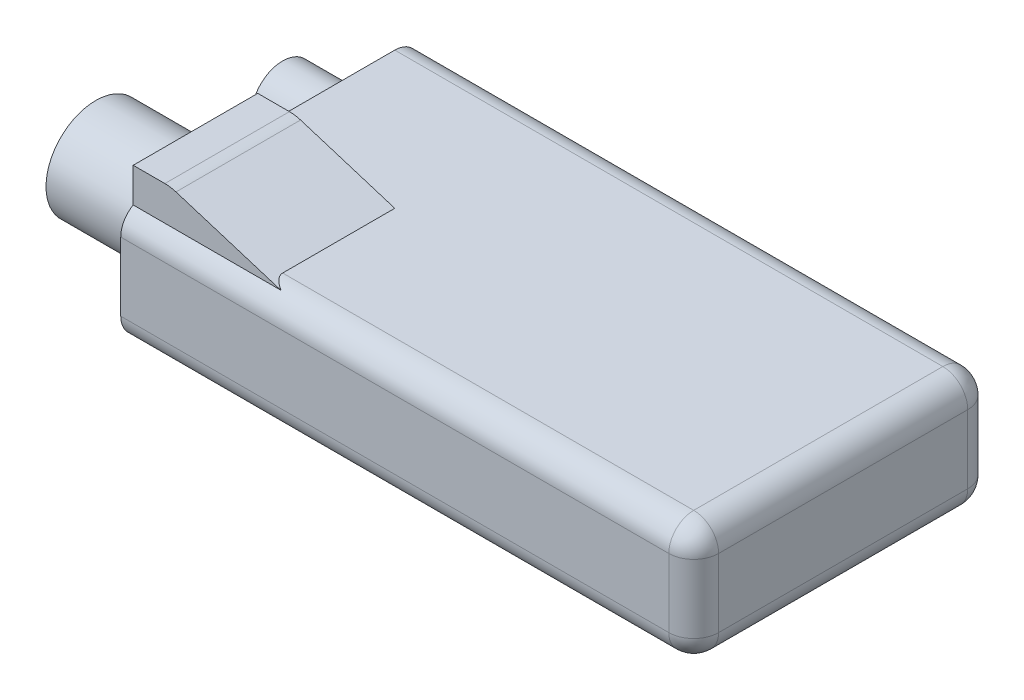
ISO-10303-21;
HEADER;
FILE_DESCRIPTION(('STEP AP214'),'2;1');
FILE_NAME('part.step','',(''),(''),'','','');
FILE_SCHEMA(('AUTOMOTIVE_DESIGN { 1 0 10303 214 1 1 1 1 }'));
ENDSEC;
DATA;
#1=APPLICATION_CONTEXT('core data for automotive mechanical design processes');
#2=APPLICATION_PROTOCOL_DEFINITION('international standard','automotive_design',2000,#1);
#3=PRODUCT_CONTEXT('',#1,'mechanical');
#4=PRODUCT('Part','Part','',(#3));
#5=PRODUCT_RELATED_PRODUCT_CATEGORY('part','',(#4));
#6=PRODUCT_DEFINITION_FORMATION('','',#4);
#7=PRODUCT_DEFINITION_CONTEXT('part definition',#1,'design');
#8=PRODUCT_DEFINITION('design','',#6,#7);
#9=PRODUCT_DEFINITION_SHAPE('','',#8);
#10=(LENGTH_UNIT() NAMED_UNIT(*) SI_UNIT(.MILLI.,.METRE.));
#11=(NAMED_UNIT(*) PLANE_ANGLE_UNIT() SI_UNIT($,.RADIAN.));
#12=(NAMED_UNIT(*) SI_UNIT($,.STERADIAN.) SOLID_ANGLE_UNIT());
#13=UNCERTAINTY_MEASURE_WITH_UNIT(LENGTH_MEASURE(1.E-05),#10,'distance_accuracy_value','');
#14=(GEOMETRIC_REPRESENTATION_CONTEXT(3) GLOBAL_UNCERTAINTY_ASSIGNED_CONTEXT((#13)) GLOBAL_UNIT_ASSIGNED_CONTEXT((#10,
#11,#12)) REPRESENTATION_CONTEXT('',''));
#15=CARTESIAN_POINT('',(0.,0.,0.));
#16=DIRECTION('',(0.,0.,1.));
#17=DIRECTION('',(1.,0.,0.));
#18=AXIS2_PLACEMENT_3D('',#15,#16,#17);
#19=CARTESIAN_POINT('',(-23.,9.5,-12.));
#20=DIRECTION('',(1.,0.,0.));
#21=DIRECTION('',(0.,0.,-1.));
#22=AXIS2_PLACEMENT_3D('',#19,#20,#21);
#23=PLANE('',#22);
#24=CARTESIAN_POINT('',(-23.,6.,6.));
#25=DIRECTION('',(-1.,0.,0.));
#26=DIRECTION('',(0.,0.,1.));
#27=AXIS2_PLACEMENT_3D('',#24,#25,#26);
#28=CIRCLE('',#27,4.);
#29=CARTESIAN_POINT('',(-23.,6.,10.));
#30=VERTEX_POINT('',#29);
#31=EDGE_CURVE('E162',#30,#30,#28,.T.);
#32=ORIENTED_EDGE('',*,*,#31,.F.);
#33=EDGE_LOOP('',(#32));
#34=FACE_BOUND('',#33,.T.);
#35=DIRECTION('',(0.,0.,1.));
#36=VECTOR('',#35,1.);
#37=CARTESIAN_POINT('',(-23.,0.,-12.));
#38=LINE('',#37,#36);
#39=CARTESIAN_POINT('',(-23.,0.,-10.));
#40=VERTEX_POINT('',#39);
#41=CARTESIAN_POINT('',(-23.,0.,10.));
#42=VERTEX_POINT('',#41);
#43=EDGE_CURVE('E196',#40,#42,#38,.T.);
#44=ORIENTED_EDGE('',*,*,#43,.T.);
#45=CARTESIAN_POINT('',(-23.,2.,10.));
#46=DIRECTION('',(1.,0.,0.));
#47=DIRECTION('',(0.,0.,-1.));
#48=AXIS2_PLACEMENT_3D('',#45,#46,#47);
#49=CIRCLE('',#48,2.);
#50=CARTESIAN_POINT('',(-23.,2.,12.));
#51=VERTEX_POINT('',#50);
#52=EDGE_CURVE('E233',#42,#51,#49,.F.);
#53=ORIENTED_EDGE('',*,*,#52,.T.);
#54=DIRECTION('',(0.,-1.,0.));
#55=VECTOR('',#54,1.);
#56=CARTESIAN_POINT('',(-23.,9.5,12.));
#57=LINE('',#56,#55);
#58=CARTESIAN_POINT('',(-23.,7.5,12.));
#59=VERTEX_POINT('',#58);
#60=EDGE_CURVE('E201',#59,#51,#57,.T.);
#61=ORIENTED_EDGE('',*,*,#60,.F.);
#62=CARTESIAN_POINT('',(-23.,7.5,10.));
#63=DIRECTION('',(1.,0.,0.));
#64=DIRECTION('',(0.,0.,-1.));
#65=AXIS2_PLACEMENT_3D('',#62,#63,#64);
#66=CIRCLE('',#65,2.);
#67=CARTESIAN_POINT('',(-23.,9.23205080756888,11.));
#68=VERTEX_POINT('',#67);
#69=EDGE_CURVE('E226',#59,#68,#66,.F.);
#70=ORIENTED_EDGE('',*,*,#69,.T.);
#71=DIRECTION('',(0.,1.,0.));
#72=VECTOR('',#71,1.);
#73=CARTESIAN_POINT('',(-23.,6.00753183787218,11.));
#74=LINE('',#73,#72);
#75=CARTESIAN_POINT('',(-23.,11.9924681621278,11.));
#76=VERTEX_POINT('',#75);
#77=EDGE_CURVE('E183',#68,#76,#74,.T.);
#78=ORIENTED_EDGE('',*,*,#77,.T.);
#79=DIRECTION('',(0.,0.,-1.));
#80=VECTOR('',#79,1.);
#81=CARTESIAN_POINT('',(-23.,11.9924681621278,11.));
#82=LINE('',#81,#80);
#83=CARTESIAN_POINT('',(-23.,11.9924681621278,1.));
#84=VERTEX_POINT('',#83);
#85=EDGE_CURVE('E186',#76,#84,#82,.T.);
#86=ORIENTED_EDGE('',*,*,#85,.T.);
#87=DIRECTION('',(0.,-1.,0.));
#88=VECTOR('',#87,1.);
#89=CARTESIAN_POINT('',(-23.,6.00753183787218,1.));
#90=LINE('',#89,#88);
#91=CARTESIAN_POINT('',(-23.,9.5,1.));
#92=VERTEX_POINT('',#91);
#93=EDGE_CURVE('E171',#84,#92,#90,.T.);
#94=ORIENTED_EDGE('',*,*,#93,.T.);
#95=DIRECTION('',(0.,0.,1.));
#96=VECTOR('',#95,1.);
#97=CARTESIAN_POINT('',(-23.,9.5,-12.));
#98=LINE('',#97,#96);
#99=CARTESIAN_POINT('',(-23.,9.5,-10.));
#100=VERTEX_POINT('',#99);
#101=EDGE_CURVE('E157',#100,#92,#98,.T.);
#102=ORIENTED_EDGE('',*,*,#101,.F.);
#103=CARTESIAN_POINT('',(-23.,7.5,-10.));
#104=DIRECTION('',(1.,0.,0.));
#105=DIRECTION('',(0.,0.,-1.));
#106=AXIS2_PLACEMENT_3D('',#103,#104,#105);
#107=CIRCLE('',#106,2.);
#108=CARTESIAN_POINT('',(-23.,7.5,-12.));
#109=VERTEX_POINT('',#108);
#110=EDGE_CURVE('E229',#100,#109,#107,.F.);
#111=ORIENTED_EDGE('',*,*,#110,.T.);
#112=DIRECTION('',(0.,-1.,0.));
#113=VECTOR('',#112,1.);
#114=CARTESIAN_POINT('',(-23.,9.5,-12.));
#115=LINE('',#114,#113);
#116=CARTESIAN_POINT('',(-23.,2.,-12.));
#117=VERTEX_POINT('',#116);
#118=EDGE_CURVE('E199',#109,#117,#115,.T.);
#119=ORIENTED_EDGE('',*,*,#118,.T.);
#120=CARTESIAN_POINT('',(-23.,2.,-10.));
#121=DIRECTION('',(1.,0.,0.));
#122=DIRECTION('',(0.,0.,-1.));
#123=AXIS2_PLACEMENT_3D('',#120,#121,#122);
#124=CIRCLE('',#123,2.);
#125=EDGE_CURVE('E231',#117,#40,#124,.F.);
#126=ORIENTED_EDGE('',*,*,#125,.T.);
#127=EDGE_LOOP('',(#44,#53,#61,#70,#78,#86,#94,#102,#111,#119,#126));
#128=FACE_BOUND('',#127,.T.);
#129=CARTESIAN_POINT('',(-23.,4.74939435504496,-7.));
#130=DIRECTION('',(1.,0.,0.));
#131=DIRECTION('',(0.,0.,-1.));
#132=AXIS2_PLACEMENT_3D('',#129,#130,#131);
#133=CIRCLE('',#132,2.5);
#134=CARTESIAN_POINT('',(-23.,4.74939435504496,-9.5));
#135=VERTEX_POINT('',#134);
#136=EDGE_CURVE('E161',#135,#135,#133,.F.);
#137=ORIENTED_EDGE('',*,*,#136,.F.);
#138=EDGE_LOOP('',(#137));
#139=FACE_BOUND('',#138,.T.);
#140=ADVANCED_FACE('F40',(#34,#128,#139),#23,.F.);
#141=CARTESIAN_POINT('',(23.,9.5,-12.));
#142=DIRECTION('',(-1.,0.,0.));
#143=DIRECTION('',(0.,0.,1.));
#144=AXIS2_PLACEMENT_3D('',#141,#142,#143);
#145=PLANE('',#144);
#146=DIRECTION('',(0.,-1.,0.));
#147=VECTOR('',#146,1.);
#148=CARTESIAN_POINT('',(23.,9.5,-10.));
#149=LINE('',#148,#147);
#150=CARTESIAN_POINT('',(23.,2.,-10.));
#151=VERTEX_POINT('',#150);
#152=CARTESIAN_POINT('',(23.,7.5,-10.));
#153=VERTEX_POINT('',#152);
#154=EDGE_CURVE('E257',#151,#153,#149,.F.);
#155=ORIENTED_EDGE('',*,*,#154,.T.);
#156=DIRECTION('',(0.,0.,-1.));
#157=VECTOR('',#156,1.);
#158=CARTESIAN_POINT('',(23.,7.5,10.));
#159=LINE('',#158,#157);
#160=CARTESIAN_POINT('',(23.,7.5,10.));
#161=VERTEX_POINT('',#160);
#162=EDGE_CURVE('E259',#153,#161,#159,.F.);
#163=ORIENTED_EDGE('',*,*,#162,.T.);
#164=DIRECTION('',(0.,-1.,0.));
#165=VECTOR('',#164,1.);
#166=CARTESIAN_POINT('',(23.,9.5,10.));
#167=LINE('',#166,#165);
#168=CARTESIAN_POINT('',(23.,2.,10.));
#169=VERTEX_POINT('',#168);
#170=EDGE_CURVE('E253',#161,#169,#167,.T.);
#171=ORIENTED_EDGE('',*,*,#170,.T.);
#172=DIRECTION('',(0.,0.,-1.));
#173=VECTOR('',#172,1.);
#174=CARTESIAN_POINT('',(23.,2.,-12.));
#175=LINE('',#174,#173);
#176=EDGE_CURVE('E255',#169,#151,#175,.T.);
#177=ORIENTED_EDGE('',*,*,#176,.T.);
#178=EDGE_LOOP('',(#155,#163,#171,#177));
#179=FACE_BOUND('',#178,.T.);
#180=ADVANCED_FACE('F308',(#179),#145,.F.);
#181=CARTESIAN_POINT('',(-23.,9.5,-12.));
#182=DIRECTION('',(0.,0.,1.));
#183=DIRECTION('',(1.,0.,0.));
#184=AXIS2_PLACEMENT_3D('',#181,#182,#183);
#185=PLANE('',#184);
#186=DIRECTION('',(-1.,0.,0.));
#187=VECTOR('',#186,1.);
#188=CARTESIAN_POINT('',(23.,7.5,-12.));
#189=LINE('',#188,#187);
#190=CARTESIAN_POINT('',(21.,7.5,-12.));
#191=VERTEX_POINT('',#190);
#192=EDGE_CURVE('E235',#109,#191,#189,.F.);
#193=ORIENTED_EDGE('',*,*,#192,.T.);
#194=DIRECTION('',(0.,-1.,0.));
#195=VECTOR('',#194,1.);
#196=CARTESIAN_POINT('',(21.,9.5,-12.));
#197=LINE('',#196,#195);
#198=CARTESIAN_POINT('',(21.,2.,-12.));
#199=VERTEX_POINT('',#198);
#200=EDGE_CURVE('E264',#191,#199,#197,.T.);
#201=ORIENTED_EDGE('',*,*,#200,.T.);
#202=DIRECTION('',(-1.,0.,0.));
#203=VECTOR('',#202,1.);
#204=CARTESIAN_POINT('',(-23.,2.,-12.));
#205=LINE('',#204,#203);
#206=EDGE_CURVE('E238',#199,#117,#205,.T.);
#207=ORIENTED_EDGE('',*,*,#206,.T.);
#208=ORIENTED_EDGE('',*,*,#118,.F.);
#209=EDGE_LOOP('',(#193,#201,#207,#208));
#210=FACE_BOUND('',#209,.T.);
#211=ADVANCED_FACE('F314',(#210),#185,.F.);
#212=CARTESIAN_POINT('',(-23.,9.5,12.));
#213=DIRECTION('',(0.,0.,-1.));
#214=DIRECTION('',(-1.,0.,0.));
#215=AXIS2_PLACEMENT_3D('',#212,#213,#214);
#216=PLANE('',#215);
#217=DIRECTION('',(1.,0.,0.));
#218=VECTOR('',#217,1.);
#219=CARTESIAN_POINT('',(-23.,2.,12.));
#220=LINE('',#219,#218);
#221=CARTESIAN_POINT('',(21.,2.,12.));
#222=VERTEX_POINT('',#221);
#223=EDGE_CURVE('E220',#51,#222,#220,.T.);
#224=ORIENTED_EDGE('',*,*,#223,.T.);
#225=DIRECTION('',(0.,-1.,0.));
#226=VECTOR('',#225,1.);
#227=CARTESIAN_POINT('',(21.,9.5,12.));
#228=LINE('',#227,#226);
#229=CARTESIAN_POINT('',(21.,7.5,12.));
#230=VERTEX_POINT('',#229);
#231=EDGE_CURVE('E11',#222,#230,#228,.F.);
#232=ORIENTED_EDGE('',*,*,#231,.T.);
#233=DIRECTION('',(1.,0.,0.));
#234=VECTOR('',#233,1.);
#235=CARTESIAN_POINT('',(-23.,7.5,12.));
#236=LINE('',#235,#234);
#237=EDGE_CURVE('E218',#230,#59,#236,.F.);
#238=ORIENTED_EDGE('',*,*,#237,.T.);
#239=ORIENTED_EDGE('',*,*,#60,.T.);
#240=EDGE_LOOP('',(#224,#232,#238,#239));
#241=FACE_BOUND('',#240,.T.);
#242=ADVANCED_FACE('F321',(#241),#216,.F.);
#243=CARTESIAN_POINT('',(0.,9.5,0.));
#244=DIRECTION('',(0.,1.,0.));
#245=DIRECTION('',(0.,0.,1.));
#246=AXIS2_PLACEMENT_3D('',#243,#244,#245);
#247=PLANE('',#246);
#248=DIRECTION('',(1.,0.,0.));
#249=VECTOR('',#248,1.);
#250=CARTESIAN_POINT('',(23.,9.5,10.));
#251=LINE('',#250,#249);
#252=CARTESIAN_POINT('',(-12.,9.5,10.));
#253=VERTEX_POINT('',#252);
#254=CARTESIAN_POINT('',(21.,9.5,10.));
#255=VERTEX_POINT('',#254);
#256=EDGE_CURVE('E240',#253,#255,#251,.T.);
#257=ORIENTED_EDGE('',*,*,#256,.T.);
#258=DIRECTION('',(0.,0.,-1.));
#259=VECTOR('',#258,1.);
#260=CARTESIAN_POINT('',(21.,9.5,-10.));
#261=LINE('',#260,#259);
#262=CARTESIAN_POINT('',(21.,9.5,-10.));
#263=VERTEX_POINT('',#262);
#264=EDGE_CURVE('E251',#255,#263,#261,.T.);
#265=ORIENTED_EDGE('',*,*,#264,.T.);
#266=DIRECTION('',(-1.,0.,0.));
#267=VECTOR('',#266,1.);
#268=CARTESIAN_POINT('',(-23.,9.5,-10.));
#269=LINE('',#268,#267);
#270=EDGE_CURVE('E242',#263,#100,#269,.T.);
#271=ORIENTED_EDGE('',*,*,#270,.T.);
#272=ORIENTED_EDGE('',*,*,#101,.T.);
#273=DIRECTION('',(-1.,0.,0.));
#274=VECTOR('',#273,1.);
#275=CARTESIAN_POINT('',(0.,9.5,0.999999999999999));
#276=LINE('',#275,#274);
#277=CARTESIAN_POINT('',(-12.,9.5,1.));
#278=VERTEX_POINT('',#277);
#279=EDGE_CURVE('E149',#278,#92,#276,.T.);
#280=ORIENTED_EDGE('',*,*,#279,.F.);
#281=DIRECTION('',(0.,0.,1.));
#282=VECTOR('',#281,1.);
#283=CARTESIAN_POINT('',(-12.,9.5,-7.3792838321196));
#284=LINE('',#283,#282);
#285=EDGE_CURVE('E154',#278,#253,#284,.T.);
#286=ORIENTED_EDGE('',*,*,#285,.T.);
#287=EDGE_LOOP('',(#257,#265,#271,#272,#280,#286));
#288=FACE_BOUND('',#287,.T.);
#289=ADVANCED_FACE('F152',(#288),#247,.T.);
#290=CARTESIAN_POINT('',(0.,0.,0.));
#291=DIRECTION('',(0.,1.,0.));
#292=DIRECTION('',(0.,0.,1.));
#293=AXIS2_PLACEMENT_3D('',#290,#291,#292);
#294=PLANE('',#293);
#295=DIRECTION('',(-1.,0.,0.));
#296=VECTOR('',#295,1.);
#297=CARTESIAN_POINT('',(0.,0.,-10.));
#298=LINE('',#297,#296);
#299=CARTESIAN_POINT('',(21.,0.,-10.));
#300=VERTEX_POINT('',#299);
#301=EDGE_CURVE('E222',#40,#300,#298,.F.);
#302=ORIENTED_EDGE('',*,*,#301,.T.);
#303=DIRECTION('',(0.,0.,-1.));
#304=VECTOR('',#303,1.);
#305=CARTESIAN_POINT('',(21.,0.,0.));
#306=LINE('',#305,#304);
#307=CARTESIAN_POINT('',(21.,0.,10.));
#308=VERTEX_POINT('',#307);
#309=EDGE_CURVE('E64',#300,#308,#306,.F.);
#310=ORIENTED_EDGE('',*,*,#309,.T.);
#311=DIRECTION('',(1.,0.,0.));
#312=VECTOR('',#311,1.);
#313=CARTESIAN_POINT('',(0.,0.,10.));
#314=LINE('',#313,#312);
#315=EDGE_CURVE('E224',#308,#42,#314,.F.);
#316=ORIENTED_EDGE('',*,*,#315,.T.);
#317=ORIENTED_EDGE('',*,*,#43,.F.);
#318=EDGE_LOOP('',(#302,#310,#316,#317));
#319=FACE_BOUND('',#318,.T.);
#320=ADVANCED_FACE('F410',(#319),#294,.F.);
#321=CARTESIAN_POINT('',(-31.,6.,6.));
#322=DIRECTION('',(1.,0.,0.));
#323=DIRECTION('',(0.,0.,-1.));
#324=AXIS2_PLACEMENT_3D('',#321,#322,#323);
#325=CYLINDRICAL_SURFACE('',#324,4.);
#326=CARTESIAN_POINT('',(-31.,6.,6.));
#327=DIRECTION('',(-1.,0.,0.));
#328=DIRECTION('',(0.,0.,1.));
#329=AXIS2_PLACEMENT_3D('',#326,#327,#328);
#330=CIRCLE('',#329,4.);
#331=CARTESIAN_POINT('',(-31.,6.,10.));
#332=VERTEX_POINT('',#331);
#333=EDGE_CURVE('E192',#332,#332,#330,.T.);
#334=ORIENTED_EDGE('',*,*,#333,.F.);
#335=EDGE_LOOP('',(#334));
#336=FACE_BOUND('',#335,.T.);
#337=ORIENTED_EDGE('',*,*,#31,.T.);
#338=EDGE_LOOP('',(#337));
#339=FACE_BOUND('',#338,.T.);
#340=ADVANCED_FACE('F412',(#336,#339),#325,.T.);
#341=CARTESIAN_POINT('',(-31.,6.,6.));
#342=DIRECTION('',(-1.,0.,0.));
#343=DIRECTION('',(0.,0.,1.));
#344=AXIS2_PLACEMENT_3D('',#341,#342,#343);
#345=PLANE('',#344);
#346=ORIENTED_EDGE('',*,*,#333,.T.);
#347=EDGE_LOOP('',(#346));
#348=FACE_BOUND('',#347,.T.);
#349=ADVANCED_FACE('F417',(#348),#345,.T.);
#350=CARTESIAN_POINT('',(-20.,6.00753183787218,1.));
#351=DIRECTION('',(0.,0.,-1.));
#352=DIRECTION('',(-1.,0.,0.));
#353=AXIS2_PLACEMENT_3D('',#350,#351,#352);
#354=PLANE('',#353);
#355=DIRECTION('',(-1.,0.,0.));
#356=VECTOR('',#355,1.);
#357=CARTESIAN_POINT('',(-20.,11.9924681621278,1.));
#358=LINE('',#357,#356);
#359=CARTESIAN_POINT('',(-20.4565159602229,11.9924681621278,1.));
#360=VERTEX_POINT('',#359);
#361=EDGE_CURVE('E190',#360,#84,#358,.T.);
#362=ORIENTED_EDGE('',*,*,#361,.F.);
#363=CARTESIAN_POINT('',(-20.4565159602229,8.99246816212782,1.));
#364=DIRECTION('',(0.,0.,-1.));
#365=DIRECTION('',(-1.,0.,0.));
#366=AXIS2_PLACEMENT_3D('',#363,#364,#365);
#367=CIRCLE('',#366,3.);
#368=CARTESIAN_POINT('',(-19.5641479922444,11.8566747555365,1.));
#369=VERTEX_POINT('',#368);
#370=EDGE_CURVE('E168',#360,#369,#367,.T.);
#371=ORIENTED_EDGE('',*,*,#370,.T.);
#372=DIRECTION('',(-0.954735531136239,0.297455989326159,0.));
#373=VECTOR('',#372,1.);
#374=CARTESIAN_POINT('',(-12.,9.5,0.999999999999999));
#375=LINE('',#374,#373);
#376=EDGE_CURVE('E165',#278,#369,#375,.T.);
#377=ORIENTED_EDGE('',*,*,#376,.F.);
#378=ORIENTED_EDGE('',*,*,#279,.T.);
#379=ORIENTED_EDGE('',*,*,#93,.F.);
#380=EDGE_LOOP('',(#362,#371,#377,#378,#379));
#381=FACE_BOUND('',#380,.T.);
#382=ADVANCED_FACE('F167',(#381),#354,.T.);
#383=CARTESIAN_POINT('',(-20.,11.9924681621278,11.));
#384=DIRECTION('',(0.,1.,0.));
#385=DIRECTION('',(0.,0.,1.));
#386=AXIS2_PLACEMENT_3D('',#383,#384,#385);
#387=PLANE('',#386);
#388=DIRECTION('',(-1.,0.,0.));
#389=VECTOR('',#388,1.);
#390=CARTESIAN_POINT('',(-20.,11.9924681621278,11.));
#391=LINE('',#390,#389);
#392=CARTESIAN_POINT('',(-20.4565159602229,11.9924681621278,11.));
#393=VERTEX_POINT('',#392);
#394=EDGE_CURVE('E189',#393,#76,#391,.T.);
#395=ORIENTED_EDGE('',*,*,#394,.F.);
#396=DIRECTION('',(0.,0.,-1.));
#397=VECTOR('',#396,1.);
#398=CARTESIAN_POINT('',(-20.4565159602229,11.9924681621278,11.));
#399=LINE('',#398,#397);
#400=EDGE_CURVE('E210',#393,#360,#399,.T.);
#401=ORIENTED_EDGE('',*,*,#400,.T.);
#402=ORIENTED_EDGE('',*,*,#361,.T.);
#403=ORIENTED_EDGE('',*,*,#85,.F.);
#404=EDGE_LOOP('',(#395,#401,#402,#403));
#405=FACE_BOUND('',#404,.T.);
#406=ADVANCED_FACE('F404',(#405),#387,.T.);
#407=CARTESIAN_POINT('',(-20.,6.00753183787218,11.));
#408=DIRECTION('',(0.,0.,1.));
#409=DIRECTION('',(1.,0.,0.));
#410=AXIS2_PLACEMENT_3D('',#407,#408,#409);
#411=PLANE('',#410);
#412=DIRECTION('',(-0.954735531136239,0.297455989326159,0.));
#413=VECTOR('',#412,1.);
#414=CARTESIAN_POINT('',(-12.,9.5,11.));
#415=LINE('',#414,#413);
#416=CARTESIAN_POINT('',(-11.1399715462689,9.23205080756889,11.));
#417=VERTEX_POINT('',#416);
#418=CARTESIAN_POINT('',(-19.5641479922444,11.8566747555365,11.));
#419=VERTEX_POINT('',#418);
#420=EDGE_CURVE('E176',#417,#419,#415,.T.);
#421=ORIENTED_EDGE('',*,*,#420,.T.);
#422=CARTESIAN_POINT('',(-20.4565159602229,8.99246816212782,11.));
#423=DIRECTION('',(0.,0.,1.));
#424=DIRECTION('',(1.,0.,0.));
#425=AXIS2_PLACEMENT_3D('',#422,#423,#424);
#426=CIRCLE('',#425,3.);
#427=EDGE_CURVE('E216',#419,#393,#426,.T.);
#428=ORIENTED_EDGE('',*,*,#427,.T.);
#429=ORIENTED_EDGE('',*,*,#394,.T.);
#430=ORIENTED_EDGE('',*,*,#77,.F.);
#431=DIRECTION('',(-1.,0.,0.));
#432=VECTOR('',#431,1.);
#433=CARTESIAN_POINT('',(-23.,9.23205080756888,11.));
#434=LINE('',#433,#432);
#435=EDGE_CURVE('E244',#68,#417,#434,.F.);
#436=ORIENTED_EDGE('',*,*,#435,.T.);
#437=EDGE_LOOP('',(#421,#428,#429,#430,#436));
#438=FACE_BOUND('',#437,.T.);
#439=ADVANCED_FACE('F408',(#438),#411,.T.);
#440=CARTESIAN_POINT('',(-12.,9.5,-7.3792838321196));
#441=DIRECTION('',(0.297455989326159,0.954735531136239,0.));
#442=DIRECTION('',(-0.954735531136239,0.297455989326159,0.));
#443=AXIS2_PLACEMENT_3D('',#440,#441,#442);
#444=PLANE('',#443);
#445=ORIENTED_EDGE('',*,*,#376,.T.);
#446=DIRECTION('',(0.,0.,-1.));
#447=VECTOR('',#446,1.);
#448=CARTESIAN_POINT('',(-19.5641479922444,11.8566747555365,-7.3792838321196));
#449=LINE('',#448,#447);
#450=EDGE_CURVE('E214',#369,#419,#449,.F.);
#451=ORIENTED_EDGE('',*,*,#450,.T.);
#452=ORIENTED_EDGE('',*,*,#420,.F.);
#453=CARTESIAN_POINT('',(-5.5806602294407,7.5,10.));
#454=DIRECTION('',(0.297455989326159,0.954735531136239,0.));
#455=DIRECTION('',(-0.954735531136239,0.297455989326159,0.));
#456=AXIS2_PLACEMENT_3D('',#453,#454,#455);
#457=ELLIPSE('',#456,6.72368374404124,2.);
#458=EDGE_CURVE('E175',#417,#253,#457,.F.);
#459=ORIENTED_EDGE('',*,*,#458,.T.);
#460=ORIENTED_EDGE('',*,*,#285,.F.);
#461=EDGE_LOOP('',(#445,#451,#452,#459,#460));
#462=FACE_BOUND('',#461,.T.);
#463=ADVANCED_FACE('F173',(#462),#444,.T.);
#464=CARTESIAN_POINT('',(-29.,4.74939435504496,-7.));
#465=DIRECTION('',(1.,0.,0.));
#466=DIRECTION('',(0.,0.,-1.));
#467=AXIS2_PLACEMENT_3D('',#464,#465,#466);
#468=CYLINDRICAL_SURFACE('',#467,2.5);
#469=CARTESIAN_POINT('',(-29.,4.74939435504496,-7.));
#470=DIRECTION('',(-1.,0.,0.));
#471=DIRECTION('',(0.,0.,1.));
#472=AXIS2_PLACEMENT_3D('',#469,#470,#471);
#473=CIRCLE('',#472,2.5);
#474=CARTESIAN_POINT('',(-29.,4.74939435504496,-4.49999999999999));
#475=VERTEX_POINT('',#474);
#476=EDGE_CURVE('E179',#475,#475,#473,.T.);
#477=ORIENTED_EDGE('',*,*,#476,.F.);
#478=EDGE_LOOP('',(#477));
#479=FACE_BOUND('',#478,.T.);
#480=ORIENTED_EDGE('',*,*,#136,.T.);
#481=EDGE_LOOP('',(#480));
#482=FACE_BOUND('',#481,.T.);
#483=ADVANCED_FACE('F301',(#479,#482),#468,.T.);
#484=CARTESIAN_POINT('',(-29.,4.74939435504496,-7.));
#485=DIRECTION('',(-1.,0.,0.));
#486=DIRECTION('',(0.,0.,1.));
#487=AXIS2_PLACEMENT_3D('',#484,#485,#486);
#488=PLANE('',#487);
#489=ORIENTED_EDGE('',*,*,#476,.T.);
#490=EDGE_LOOP('',(#489));
#491=FACE_BOUND('',#490,.T.);
#492=ADVANCED_FACE('F299',(#491),#488,.T.);
#493=CARTESIAN_POINT('',(-20.4565159602229,8.99246816212782,11.));
#494=DIRECTION('',(0.,0.,-1.));
#495=DIRECTION('',(-1.,0.,0.));
#496=AXIS2_PLACEMENT_3D('',#493,#494,#495);
#497=CYLINDRICAL_SURFACE('',#496,3.);
#498=ORIENTED_EDGE('',*,*,#427,.F.);
#499=ORIENTED_EDGE('',*,*,#450,.F.);
#500=ORIENTED_EDGE('',*,*,#370,.F.);
#501=ORIENTED_EDGE('',*,*,#400,.F.);
#502=EDGE_LOOP('',(#498,#499,#500,#501));
#503=FACE_BOUND('',#502,.T.);
#504=ADVANCED_FACE('F326',(#503),#497,.T.);
#505=CARTESIAN_POINT('',(-23.,2.,10.));
#506=DIRECTION('',(1.,0.,0.));
#507=DIRECTION('',(0.,0.,-1.));
#508=AXIS2_PLACEMENT_3D('',#505,#506,#507);
#509=CYLINDRICAL_SURFACE('',#508,2.);
#510=ORIENTED_EDGE('',*,*,#315,.F.);
#511=CARTESIAN_POINT('',(21.,2.,10.));
#512=DIRECTION('',(1.,0.,0.));
#513=DIRECTION('',(0.,0.,-1.));
#514=AXIS2_PLACEMENT_3D('',#511,#512,#513);
#515=CIRCLE('',#514,2.);
#516=EDGE_CURVE('E49',#308,#222,#515,.F.);
#517=ORIENTED_EDGE('',*,*,#516,.T.);
#518=ORIENTED_EDGE('',*,*,#223,.F.);
#519=ORIENTED_EDGE('',*,*,#52,.F.);
#520=EDGE_LOOP('',(#510,#517,#518,#519));
#521=FACE_BOUND('',#520,.T.);
#522=ADVANCED_FACE('F329',(#521),#509,.T.);
#523=CARTESIAN_POINT('',(-23.,2.,-10.));
#524=DIRECTION('',(-1.,0.,0.));
#525=DIRECTION('',(0.,0.,1.));
#526=AXIS2_PLACEMENT_3D('',#523,#524,#525);
#527=CYLINDRICAL_SURFACE('',#526,2.);
#528=ORIENTED_EDGE('',*,*,#206,.F.);
#529=CARTESIAN_POINT('',(21.,2.,-10.));
#530=DIRECTION('',(-1.,0.,0.));
#531=DIRECTION('',(0.,0.,1.));
#532=AXIS2_PLACEMENT_3D('',#529,#530,#531);
#533=CIRCLE('',#532,2.);
#534=EDGE_CURVE('E266',#199,#300,#533,.T.);
#535=ORIENTED_EDGE('',*,*,#534,.T.);
#536=ORIENTED_EDGE('',*,*,#301,.F.);
#537=ORIENTED_EDGE('',*,*,#125,.F.);
#538=EDGE_LOOP('',(#528,#535,#536,#537));
#539=FACE_BOUND('',#538,.T.);
#540=ADVANCED_FACE('F333',(#539),#527,.T.);
#541=CARTESIAN_POINT('',(0.,7.5,-10.));
#542=DIRECTION('',(1.,0.,0.));
#543=DIRECTION('',(0.,0.,-1.));
#544=AXIS2_PLACEMENT_3D('',#541,#542,#543);
#545=CYLINDRICAL_SURFACE('',#544,2.);
#546=ORIENTED_EDGE('',*,*,#270,.F.);
#547=CARTESIAN_POINT('',(21.,7.5,-10.));
#548=DIRECTION('',(1.,0.,0.));
#549=DIRECTION('',(0.,0.,-1.));
#550=AXIS2_PLACEMENT_3D('',#547,#548,#549);
#551=CIRCLE('',#550,2.);
#552=EDGE_CURVE('E262',#263,#191,#551,.F.);
#553=ORIENTED_EDGE('',*,*,#552,.T.);
#554=ORIENTED_EDGE('',*,*,#192,.F.);
#555=ORIENTED_EDGE('',*,*,#110,.F.);
#556=EDGE_LOOP('',(#546,#553,#554,#555));
#557=FACE_BOUND('',#556,.T.);
#558=ADVANCED_FACE('F336',(#557),#545,.T.);
#559=CARTESIAN_POINT('',(0.,7.5,10.));
#560=DIRECTION('',(-1.,0.,0.));
#561=DIRECTION('',(0.,0.,1.));
#562=AXIS2_PLACEMENT_3D('',#559,#560,#561);
#563=CYLINDRICAL_SURFACE('',#562,2.);
#564=ORIENTED_EDGE('',*,*,#237,.F.);
#565=CARTESIAN_POINT('',(21.,7.5,10.));
#566=DIRECTION('',(-1.,0.,0.));
#567=DIRECTION('',(0.,0.,1.));
#568=AXIS2_PLACEMENT_3D('',#565,#566,#567);
#569=CIRCLE('',#568,2.);
#570=EDGE_CURVE('E248',#230,#255,#569,.T.);
#571=ORIENTED_EDGE('',*,*,#570,.T.);
#572=ORIENTED_EDGE('',*,*,#256,.F.);
#573=ORIENTED_EDGE('',*,*,#458,.F.);
#574=ORIENTED_EDGE('',*,*,#435,.F.);
#575=ORIENTED_EDGE('',*,*,#69,.F.);
#576=EDGE_LOOP('',(#564,#571,#572,#573,#574,#575));
#577=FACE_BOUND('',#576,.T.);
#578=ADVANCED_FACE('F340',(#577),#563,.T.);
#579=CARTESIAN_POINT('',(21.,2.,-10.));
#580=DIRECTION('',(0.,0.,1.));
#581=DIRECTION('',(1.,0.,0.));
#582=AXIS2_PLACEMENT_3D('',#579,#580,#581);
#583=SPHERICAL_SURFACE('',#582,2.);
#584=CARTESIAN_POINT('',(21.,2.,-10.));
#585=DIRECTION('',(0.,0.,1.));
#586=DIRECTION('',(1.,0.,0.));
#587=AXIS2_PLACEMENT_3D('',#584,#585,#586);
#588=CIRCLE('',#587,2.);
#589=EDGE_CURVE('E285',#300,#151,#588,.T.);
#590=ORIENTED_EDGE('',*,*,#589,.F.);
#591=ORIENTED_EDGE('',*,*,#534,.F.);
#592=CARTESIAN_POINT('',(21.,2.,-10.));
#593=DIRECTION('',(0.,1.,0.));
#594=DIRECTION('',(0.,0.,1.));
#595=AXIS2_PLACEMENT_3D('',#592,#593,#594);
#596=CIRCLE('',#595,2.);
#597=EDGE_CURVE('E44',#151,#199,#596,.T.);
#598=ORIENTED_EDGE('',*,*,#597,.F.);
#599=EDGE_LOOP('',(#590,#591,#598));
#600=FACE_BOUND('',#599,.T.);
#601=ADVANCED_FACE('F42',(#600),#583,.T.);
#602=CARTESIAN_POINT('',(21.,9.5,-10.));
#603=DIRECTION('',(0.,-1.,0.));
#604=DIRECTION('',(0.,0.,-1.));
#605=AXIS2_PLACEMENT_3D('',#602,#603,#604);
#606=CYLINDRICAL_SURFACE('',#605,2.);
#607=ORIENTED_EDGE('',*,*,#597,.T.);
#608=ORIENTED_EDGE('',*,*,#200,.F.);
#609=CARTESIAN_POINT('',(21.,7.5,-10.));
#610=DIRECTION('',(0.,1.,0.));
#611=DIRECTION('',(0.,0.,1.));
#612=AXIS2_PLACEMENT_3D('',#609,#610,#611);
#613=CIRCLE('',#612,2.);
#614=EDGE_CURVE('E283',#153,#191,#613,.T.);
#615=ORIENTED_EDGE('',*,*,#614,.F.);
#616=ORIENTED_EDGE('',*,*,#154,.F.);
#617=EDGE_LOOP('',(#607,#608,#615,#616));
#618=FACE_BOUND('',#617,.T.);
#619=ADVANCED_FACE('F367',(#618),#606,.T.);
#620=CARTESIAN_POINT('',(21.,2.,-12.));
#621=DIRECTION('',(0.,0.,-1.));
#622=DIRECTION('',(-1.,0.,0.));
#623=AXIS2_PLACEMENT_3D('',#620,#621,#622);
#624=CYLINDRICAL_SURFACE('',#623,2.);
#625=ORIENTED_EDGE('',*,*,#589,.T.);
#626=ORIENTED_EDGE('',*,*,#176,.F.);
#627=CARTESIAN_POINT('',(21.,2.,10.));
#628=DIRECTION('',(0.,0.,1.));
#629=DIRECTION('',(1.,0.,0.));
#630=AXIS2_PLACEMENT_3D('',#627,#628,#629);
#631=CIRCLE('',#630,2.);
#632=EDGE_CURVE('E280',#308,#169,#631,.T.);
#633=ORIENTED_EDGE('',*,*,#632,.F.);
#634=ORIENTED_EDGE('',*,*,#309,.F.);
#635=EDGE_LOOP('',(#625,#626,#633,#634));
#636=FACE_BOUND('',#635,.T.);
#637=ADVANCED_FACE('F364',(#636),#624,.T.);
#638=CARTESIAN_POINT('',(21.,7.5,-10.));
#639=DIRECTION('',(0.,0.,1.));
#640=DIRECTION('',(1.,0.,0.));
#641=AXIS2_PLACEMENT_3D('',#638,#639,#640);
#642=SPHERICAL_SURFACE('',#641,2.);
#643=ORIENTED_EDGE('',*,*,#614,.T.);
#644=ORIENTED_EDGE('',*,*,#552,.F.);
#645=CARTESIAN_POINT('',(21.,7.5,-10.));
#646=DIRECTION('',(0.,0.,1.));
#647=DIRECTION('',(1.,0.,0.));
#648=AXIS2_PLACEMENT_3D('',#645,#646,#647);
#649=CIRCLE('',#648,2.);
#650=EDGE_CURVE('E277',#153,#263,#649,.T.);
#651=ORIENTED_EDGE('',*,*,#650,.F.);
#652=EDGE_LOOP('',(#643,#644,#651));
#653=FACE_BOUND('',#652,.T.);
#654=ADVANCED_FACE('F360',(#653),#642,.T.);
#655=CARTESIAN_POINT('',(21.,2.,10.));
#656=DIRECTION('',(0.,0.,1.));
#657=DIRECTION('',(1.,0.,0.));
#658=AXIS2_PLACEMENT_3D('',#655,#656,#657);
#659=SPHERICAL_SURFACE('',#658,2.);
#660=ORIENTED_EDGE('',*,*,#516,.F.);
#661=ORIENTED_EDGE('',*,*,#632,.T.);
#662=CARTESIAN_POINT('',(21.,2.,10.));
#663=DIRECTION('',(0.,1.,0.));
#664=DIRECTION('',(0.,0.,1.));
#665=AXIS2_PLACEMENT_3D('',#662,#663,#664);
#666=CIRCLE('',#665,2.);
#667=EDGE_CURVE('E274',#222,#169,#666,.T.);
#668=ORIENTED_EDGE('',*,*,#667,.F.);
#669=EDGE_LOOP('',(#660,#661,#668));
#670=FACE_BOUND('',#669,.T.);
#671=ADVANCED_FACE('F356',(#670),#659,.T.);
#672=CARTESIAN_POINT('',(21.,7.5,0.));
#673=DIRECTION('',(0.,0.,1.));
#674=DIRECTION('',(1.,0.,0.));
#675=AXIS2_PLACEMENT_3D('',#672,#673,#674);
#676=CYLINDRICAL_SURFACE('',#675,2.);
#677=ORIENTED_EDGE('',*,*,#650,.T.);
#678=ORIENTED_EDGE('',*,*,#264,.F.);
#679=CARTESIAN_POINT('',(21.,7.5,10.));
#680=DIRECTION('',(0.,0.,1.));
#681=DIRECTION('',(1.,0.,0.));
#682=AXIS2_PLACEMENT_3D('',#679,#680,#681);
#683=CIRCLE('',#682,2.);
#684=EDGE_CURVE('E272',#161,#255,#683,.T.);
#685=ORIENTED_EDGE('',*,*,#684,.F.);
#686=ORIENTED_EDGE('',*,*,#162,.F.);
#687=EDGE_LOOP('',(#677,#678,#685,#686));
#688=FACE_BOUND('',#687,.T.);
#689=ADVANCED_FACE('F352',(#688),#676,.T.);
#690=CARTESIAN_POINT('',(21.,9.5,10.));
#691=DIRECTION('',(0.,-1.,0.));
#692=DIRECTION('',(0.,0.,-1.));
#693=AXIS2_PLACEMENT_3D('',#690,#691,#692);
#694=CYLINDRICAL_SURFACE('',#693,2.);
#695=ORIENTED_EDGE('',*,*,#667,.T.);
#696=ORIENTED_EDGE('',*,*,#170,.F.);
#697=CARTESIAN_POINT('',(21.,7.5,10.));
#698=DIRECTION('',(0.,1.,0.));
#699=DIRECTION('',(0.,0.,1.));
#700=AXIS2_PLACEMENT_3D('',#697,#698,#699);
#701=CIRCLE('',#700,2.);
#702=EDGE_CURVE('E270',#230,#161,#701,.T.);
#703=ORIENTED_EDGE('',*,*,#702,.F.);
#704=ORIENTED_EDGE('',*,*,#231,.F.);
#705=EDGE_LOOP('',(#695,#696,#703,#704));
#706=FACE_BOUND('',#705,.T.);
#707=ADVANCED_FACE('F348',(#706),#694,.T.);
#708=CARTESIAN_POINT('',(21.,7.5,10.));
#709=DIRECTION('',(0.,0.,1.));
#710=DIRECTION('',(1.,0.,0.));
#711=AXIS2_PLACEMENT_3D('',#708,#709,#710);
#712=SPHERICAL_SURFACE('',#711,2.);
#713=ORIENTED_EDGE('',*,*,#684,.T.);
#714=ORIENTED_EDGE('',*,*,#570,.F.);
#715=ORIENTED_EDGE('',*,*,#702,.T.);
#716=EDGE_LOOP('',(#713,#714,#715));
#717=FACE_BOUND('',#716,.T.);
#718=ADVANCED_FACE('F345',(#717),#712,.T.);
#719=CLOSED_SHELL('',(#140,#180,#211,#242,#289,#320,#340,#349,#382,#406,#439,#463,#483,#492,
#504,#522,#540,#558,#578,#601,#619,#637,#654,#671,#689,#707,#718));
#720=MANIFOLD_SOLID_BREP('B2',#719);
#721=ADVANCED_BREP_SHAPE_REPRESENTATION('',(#18,#720),#14);
#722=SHAPE_DEFINITION_REPRESENTATION(#9,#721);
ENDSEC;
END-ISO-10303-21;
